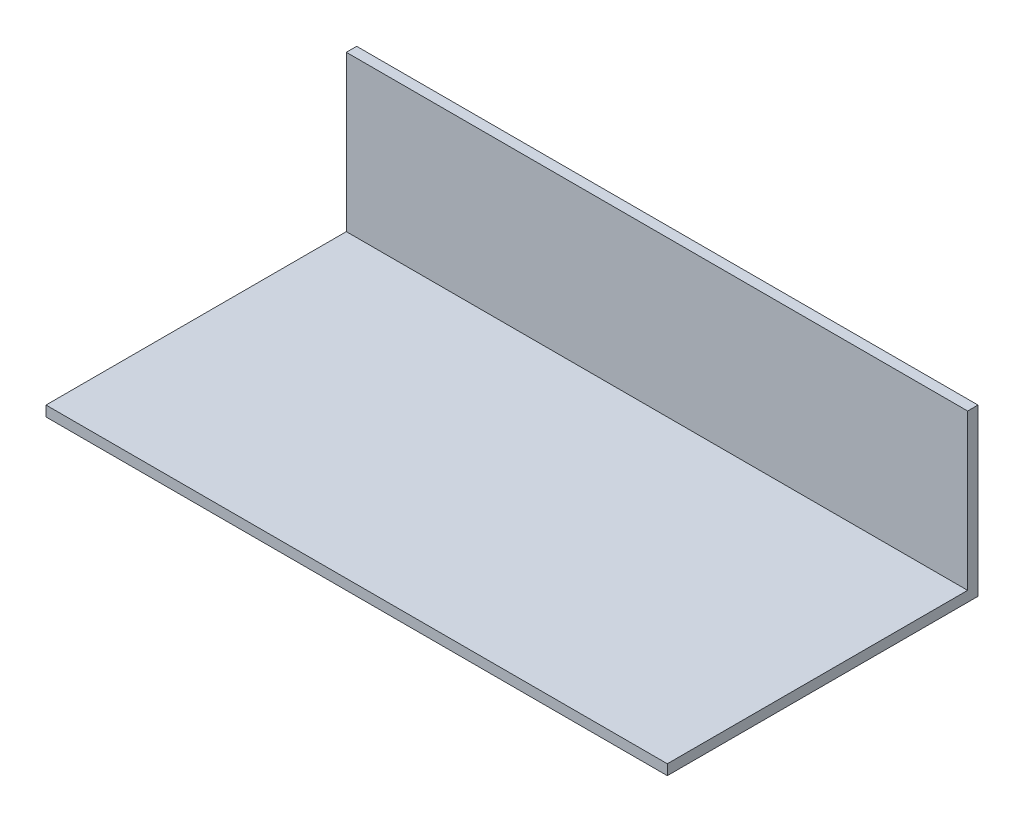
ISO-10303-21;
HEADER;
FILE_DESCRIPTION(('STEP AP214'),'2;1');
FILE_NAME('part.step','',(''),(''),'','','');
FILE_SCHEMA(('AUTOMOTIVE_DESIGN { 1 0 10303 214 1 1 1 1 }'));
ENDSEC;
DATA;
#1=APPLICATION_CONTEXT('core data for automotive mechanical design processes');
#2=APPLICATION_PROTOCOL_DEFINITION('international standard','automotive_design',2000,#1);
#3=PRODUCT_CONTEXT('',#1,'mechanical');
#4=PRODUCT('Part','Part','',(#3));
#5=PRODUCT_RELATED_PRODUCT_CATEGORY('part','',(#4));
#6=PRODUCT_DEFINITION_FORMATION('','',#4);
#7=PRODUCT_DEFINITION_CONTEXT('part definition',#1,'design');
#8=PRODUCT_DEFINITION('design','',#6,#7);
#9=PRODUCT_DEFINITION_SHAPE('','',#8);
#10=(LENGTH_UNIT() NAMED_UNIT(*) SI_UNIT(.MILLI.,.METRE.));
#11=(NAMED_UNIT(*) PLANE_ANGLE_UNIT() SI_UNIT($,.RADIAN.));
#12=(NAMED_UNIT(*) SI_UNIT($,.STERADIAN.) SOLID_ANGLE_UNIT());
#13=UNCERTAINTY_MEASURE_WITH_UNIT(LENGTH_MEASURE(1.E-05),#10,'distance_accuracy_value','');
#14=(GEOMETRIC_REPRESENTATION_CONTEXT(3) GLOBAL_UNCERTAINTY_ASSIGNED_CONTEXT((#13)) GLOBAL_UNIT_ASSIGNED_CONTEXT((#10,
#11,#12)) REPRESENTATION_CONTEXT('',''));
#15=CARTESIAN_POINT('',(0.,0.,0.));
#16=DIRECTION('',(0.,0.,1.));
#17=DIRECTION('',(1.,0.,0.));
#18=AXIS2_PLACEMENT_3D('',#15,#16,#17);
#19=CARTESIAN_POINT('',(0.,10.,0.));
#20=DIRECTION('',(0.,-1.,0.));
#21=DIRECTION('',(0.,0.,-1.));
#22=AXIS2_PLACEMENT_3D('',#19,#20,#21);
#23=PLANE('',#22);
#24=DIRECTION('',(1.,0.,0.));
#25=VECTOR('',#24,1.);
#26=CARTESIAN_POINT('',(-300.,10.,-140.));
#27=LINE('',#26,#25);
#28=CARTESIAN_POINT('',(-300.,10.,-140.));
#29=VERTEX_POINT('',#28);
#30=CARTESIAN_POINT('',(300.,10.,-140.));
#31=VERTEX_POINT('',#30);
#32=EDGE_CURVE('E48',#29,#31,#27,.T.);
#33=ORIENTED_EDGE('',*,*,#32,.F.);
#34=DIRECTION('',(0.,0.,1.));
#35=VECTOR('',#34,1.);
#36=CARTESIAN_POINT('',(-300.,10.,150.));
#37=LINE('',#36,#35);
#38=CARTESIAN_POINT('',(-300.,10.,150.));
#39=VERTEX_POINT('',#38);
#40=EDGE_CURVE('E133',#29,#39,#37,.T.);
#41=ORIENTED_EDGE('',*,*,#40,.T.);
#42=DIRECTION('',(1.,0.,0.));
#43=VECTOR('',#42,1.);
#44=CARTESIAN_POINT('',(-300.,10.,150.));
#45=LINE('',#44,#43);
#46=CARTESIAN_POINT('',(300.,10.,150.));
#47=VERTEX_POINT('',#46);
#48=EDGE_CURVE('E54',#39,#47,#45,.T.);
#49=ORIENTED_EDGE('',*,*,#48,.T.);
#50=DIRECTION('',(0.,0.,-1.));
#51=VECTOR('',#50,1.);
#52=CARTESIAN_POINT('',(300.,10.,150.));
#53=LINE('',#52,#51);
#54=EDGE_CURVE('E83',#47,#31,#53,.T.);
#55=ORIENTED_EDGE('',*,*,#54,.T.);
#56=EDGE_LOOP('',(#33,#41,#49,#55));
#57=FACE_BOUND('',#56,.T.);
#58=ADVANCED_FACE('F33',(#57),#23,.F.);
#59=CARTESIAN_POINT('',(300.,10.,150.));
#60=DIRECTION('',(-1.,0.,0.));
#61=DIRECTION('',(0.,0.,1.));
#62=AXIS2_PLACEMENT_3D('',#59,#60,#61);
#63=PLANE('',#62);
#64=DIRECTION('',(0.,0.,-1.));
#65=VECTOR('',#64,1.);
#66=CARTESIAN_POINT('',(300.,0.,150.));
#67=LINE('',#66,#65);
#68=CARTESIAN_POINT('',(300.,0.,150.));
#69=VERTEX_POINT('',#68);
#70=CARTESIAN_POINT('',(300.,0.,-150.));
#71=VERTEX_POINT('',#70);
#72=EDGE_CURVE('E89',#69,#71,#67,.T.);
#73=ORIENTED_EDGE('',*,*,#72,.T.);
#74=DIRECTION('',(0.,-1.,0.));
#75=VECTOR('',#74,1.);
#76=CARTESIAN_POINT('',(300.,10.,-150.));
#77=LINE('',#76,#75);
#78=CARTESIAN_POINT('',(300.,160.,-150.));
#79=VERTEX_POINT('',#78);
#80=EDGE_CURVE('E11',#79,#71,#77,.T.);
#81=ORIENTED_EDGE('',*,*,#80,.F.);
#82=DIRECTION('',(0.,0.,-1.));
#83=VECTOR('',#82,1.);
#84=CARTESIAN_POINT('',(300.,160.,-150.));
#85=LINE('',#84,#83);
#86=CARTESIAN_POINT('',(300.,160.,-140.));
#87=VERTEX_POINT('',#86);
#88=EDGE_CURVE('E125',#87,#79,#85,.T.);
#89=ORIENTED_EDGE('',*,*,#88,.F.);
#90=DIRECTION('',(0.,-1.,0.));
#91=VECTOR('',#90,1.);
#92=CARTESIAN_POINT('',(300.,160.,-140.));
#93=LINE('',#92,#91);
#94=EDGE_CURVE('E98',#87,#31,#93,.T.);
#95=ORIENTED_EDGE('',*,*,#94,.T.);
#96=ORIENTED_EDGE('',*,*,#54,.F.);
#97=DIRECTION('',(0.,-1.,0.));
#98=VECTOR('',#97,1.);
#99=CARTESIAN_POINT('',(300.,10.,150.));
#100=LINE('',#99,#98);
#101=EDGE_CURVE('E76',#47,#69,#100,.T.);
#102=ORIENTED_EDGE('',*,*,#101,.T.);
#103=EDGE_LOOP('',(#73,#81,#89,#95,#96,#102));
#104=FACE_BOUND('',#103,.T.);
#105=ADVANCED_FACE('F35',(#104),#63,.F.);
#106=CARTESIAN_POINT('',(-300.,10.,-150.));
#107=DIRECTION('',(0.,0.,1.));
#108=DIRECTION('',(1.,0.,0.));
#109=AXIS2_PLACEMENT_3D('',#106,#107,#108);
#110=PLANE('',#109);
#111=DIRECTION('',(-1.,0.,0.));
#112=VECTOR('',#111,1.);
#113=CARTESIAN_POINT('',(-300.,0.,-150.));
#114=LINE('',#113,#112);
#115=CARTESIAN_POINT('',(-300.,0.,-150.));
#116=VERTEX_POINT('',#115);
#117=EDGE_CURVE('E93',#71,#116,#114,.T.);
#118=ORIENTED_EDGE('',*,*,#117,.T.);
#119=DIRECTION('',(0.,-1.,0.));
#120=VECTOR('',#119,1.);
#121=CARTESIAN_POINT('',(-300.,10.,-150.));
#122=LINE('',#121,#120);
#123=CARTESIAN_POINT('',(-300.,160.,-150.));
#124=VERTEX_POINT('',#123);
#125=EDGE_CURVE('E41',#124,#116,#122,.T.);
#126=ORIENTED_EDGE('',*,*,#125,.F.);
#127=DIRECTION('',(-1.,0.,0.));
#128=VECTOR('',#127,1.);
#129=CARTESIAN_POINT('',(-300.,160.,-150.));
#130=LINE('',#129,#128);
#131=EDGE_CURVE('E117',#79,#124,#130,.T.);
#132=ORIENTED_EDGE('',*,*,#131,.F.);
#133=ORIENTED_EDGE('',*,*,#80,.T.);
#134=EDGE_LOOP('',(#118,#126,#132,#133));
#135=FACE_BOUND('',#134,.T.);
#136=ADVANCED_FACE('F115',(#135),#110,.F.);
#137=CARTESIAN_POINT('',(-300.,10.,150.));
#138=DIRECTION('',(1.,0.,0.));
#139=DIRECTION('',(0.,0.,-1.));
#140=AXIS2_PLACEMENT_3D('',#137,#138,#139);
#141=PLANE('',#140);
#142=DIRECTION('',(0.,0.,1.));
#143=VECTOR('',#142,1.);
#144=CARTESIAN_POINT('',(-300.,0.,150.));
#145=LINE('',#144,#143);
#146=CARTESIAN_POINT('',(-300.,0.,150.));
#147=VERTEX_POINT('',#146);
#148=EDGE_CURVE('E84',#116,#147,#145,.T.);
#149=ORIENTED_EDGE('',*,*,#148,.T.);
#150=DIRECTION('',(0.,-1.,0.));
#151=VECTOR('',#150,1.);
#152=CARTESIAN_POINT('',(-300.,10.,150.));
#153=LINE('',#152,#151);
#154=EDGE_CURVE('E79',#39,#147,#153,.T.);
#155=ORIENTED_EDGE('',*,*,#154,.F.);
#156=ORIENTED_EDGE('',*,*,#40,.F.);
#157=DIRECTION('',(0.,-1.,0.));
#158=VECTOR('',#157,1.);
#159=CARTESIAN_POINT('',(-300.,160.,-140.));
#160=LINE('',#159,#158);
#161=CARTESIAN_POINT('',(-300.,160.,-140.));
#162=VERTEX_POINT('',#161);
#163=EDGE_CURVE('E94',#162,#29,#160,.T.);
#164=ORIENTED_EDGE('',*,*,#163,.F.);
#165=DIRECTION('',(0.,0.,1.));
#166=VECTOR('',#165,1.);
#167=CARTESIAN_POINT('',(-300.,160.,-150.));
#168=LINE('',#167,#166);
#169=EDGE_CURVE('E111',#124,#162,#168,.T.);
#170=ORIENTED_EDGE('',*,*,#169,.F.);
#171=ORIENTED_EDGE('',*,*,#125,.T.);
#172=EDGE_LOOP('',(#149,#155,#156,#164,#170,#171));
#173=FACE_BOUND('',#172,.T.);
#174=ADVANCED_FACE('F108',(#173),#141,.F.);
#175=CARTESIAN_POINT('',(-300.,10.,150.));
#176=DIRECTION('',(0.,0.,-1.));
#177=DIRECTION('',(-1.,0.,0.));
#178=AXIS2_PLACEMENT_3D('',#175,#176,#177);
#179=PLANE('',#178);
#180=DIRECTION('',(1.,0.,0.));
#181=VECTOR('',#180,1.);
#182=CARTESIAN_POINT('',(-300.,0.,150.));
#183=LINE('',#182,#181);
#184=EDGE_CURVE('E73',#147,#69,#183,.T.);
#185=ORIENTED_EDGE('',*,*,#184,.T.);
#186=ORIENTED_EDGE('',*,*,#101,.F.);
#187=ORIENTED_EDGE('',*,*,#48,.F.);
#188=ORIENTED_EDGE('',*,*,#154,.T.);
#189=EDGE_LOOP('',(#185,#186,#187,#188));
#190=FACE_BOUND('',#189,.T.);
#191=ADVANCED_FACE('F75',(#190),#179,.F.);
#192=CARTESIAN_POINT('',(0.,0.,0.));
#193=DIRECTION('',(0.,-1.,0.));
#194=DIRECTION('',(0.,0.,-1.));
#195=AXIS2_PLACEMENT_3D('',#192,#193,#194);
#196=PLANE('',#195);
#197=ORIENTED_EDGE('',*,*,#72,.F.);
#198=ORIENTED_EDGE('',*,*,#184,.F.);
#199=ORIENTED_EDGE('',*,*,#148,.F.);
#200=ORIENTED_EDGE('',*,*,#117,.F.);
#201=EDGE_LOOP('',(#197,#198,#199,#200));
#202=FACE_BOUND('',#201,.T.);
#203=ADVANCED_FACE('F92',(#202),#196,.T.);
#204=CARTESIAN_POINT('',(-300.,160.,-140.));
#205=DIRECTION('',(0.,0.,-1.));
#206=DIRECTION('',(-1.,0.,0.));
#207=AXIS2_PLACEMENT_3D('',#204,#205,#206);
#208=PLANE('',#207);
#209=ORIENTED_EDGE('',*,*,#32,.T.);
#210=ORIENTED_EDGE('',*,*,#94,.F.);
#211=DIRECTION('',(1.,0.,0.));
#212=VECTOR('',#211,1.);
#213=CARTESIAN_POINT('',(-300.,160.,-140.));
#214=LINE('',#213,#212);
#215=EDGE_CURVE('E128',#162,#87,#214,.T.);
#216=ORIENTED_EDGE('',*,*,#215,.F.);
#217=ORIENTED_EDGE('',*,*,#163,.T.);
#218=EDGE_LOOP('',(#209,#210,#216,#217));
#219=FACE_BOUND('',#218,.T.);
#220=ADVANCED_FACE('F136',(#219),#208,.F.);
#221=CARTESIAN_POINT('',(0.,160.,0.));
#222=DIRECTION('',(0.,1.,0.));
#223=DIRECTION('',(0.,0.,1.));
#224=AXIS2_PLACEMENT_3D('',#221,#222,#223);
#225=PLANE('',#224);
#226=ORIENTED_EDGE('',*,*,#169,.T.);
#227=ORIENTED_EDGE('',*,*,#215,.T.);
#228=ORIENTED_EDGE('',*,*,#88,.T.);
#229=ORIENTED_EDGE('',*,*,#131,.T.);
#230=EDGE_LOOP('',(#226,#227,#228,#229));
#231=FACE_BOUND('',#230,.T.);
#232=ADVANCED_FACE('F121',(#231),#225,.T.);
#233=CLOSED_SHELL('',(#58,#105,#136,#174,#191,#203,#220,#232));
#234=MANIFOLD_SOLID_BREP('B2',#233);
#235=ADVANCED_BREP_SHAPE_REPRESENTATION('',(#18,#234),#14);
#236=SHAPE_DEFINITION_REPRESENTATION(#9,#235);
ENDSEC;
END-ISO-10303-21;
